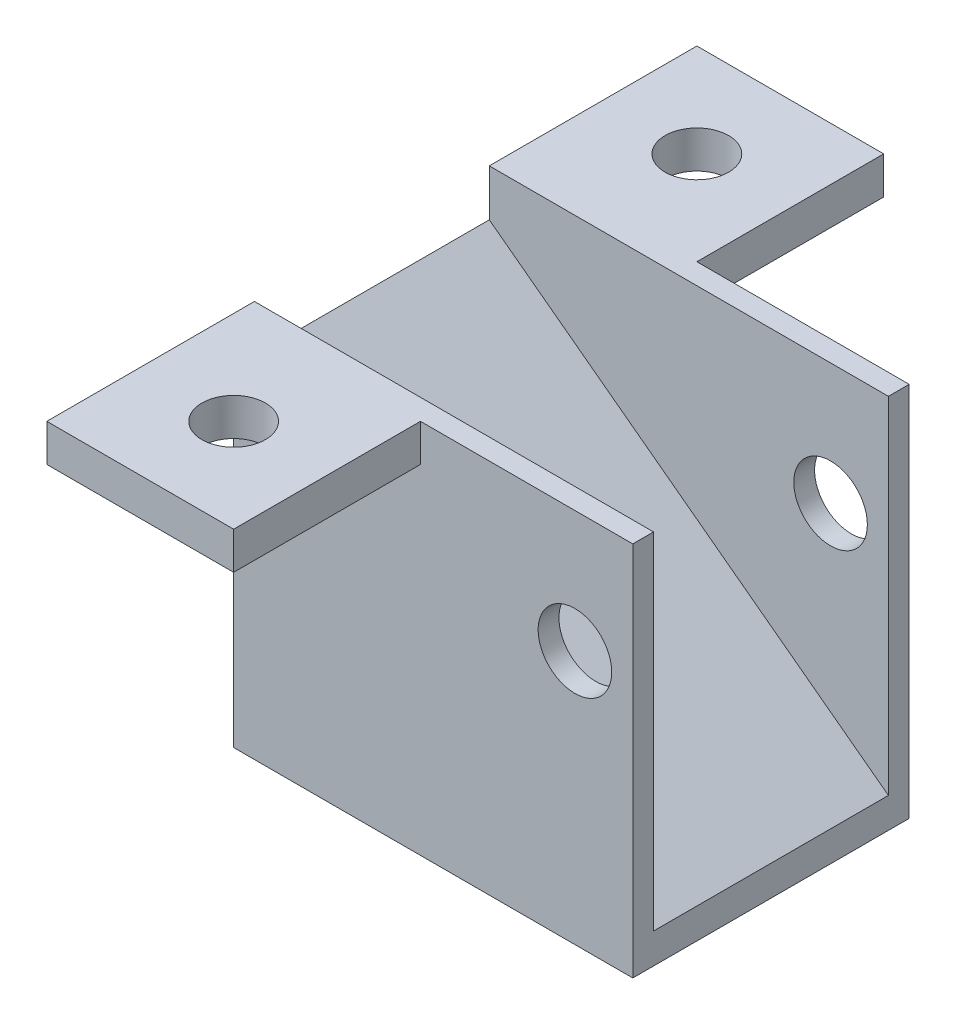
ISO-10303-21;
HEADER;
FILE_DESCRIPTION(('STEP AP214'),'2;1');
FILE_NAME('part.step','',(''),(''),'','','');
FILE_SCHEMA(('AUTOMOTIVE_DESIGN { 1 0 10303 214 1 1 1 1 }'));
ENDSEC;
DATA;
#1=APPLICATION_CONTEXT('core data for automotive mechanical design processes');
#2=APPLICATION_PROTOCOL_DEFINITION('international standard','automotive_design',2000,#1);
#3=PRODUCT_CONTEXT('',#1,'mechanical');
#4=PRODUCT('Part','Part','',(#3));
#5=PRODUCT_RELATED_PRODUCT_CATEGORY('part','',(#4));
#6=PRODUCT_DEFINITION_FORMATION('','',#4);
#7=PRODUCT_DEFINITION_CONTEXT('part definition',#1,'design');
#8=PRODUCT_DEFINITION('design','',#6,#7);
#9=PRODUCT_DEFINITION_SHAPE('','',#8);
#10=(LENGTH_UNIT() NAMED_UNIT(*) SI_UNIT(.MILLI.,.METRE.));
#11=(NAMED_UNIT(*) PLANE_ANGLE_UNIT() SI_UNIT($,.RADIAN.));
#12=(NAMED_UNIT(*) SI_UNIT($,.STERADIAN.) SOLID_ANGLE_UNIT());
#13=UNCERTAINTY_MEASURE_WITH_UNIT(LENGTH_MEASURE(1.E-05),#10,'distance_accuracy_value','');
#14=(GEOMETRIC_REPRESENTATION_CONTEXT(3) GLOBAL_UNCERTAINTY_ASSIGNED_CONTEXT((#13)) GLOBAL_UNIT_ASSIGNED_CONTEXT((#10,
#11,#12)) REPRESENTATION_CONTEXT('',''));
#15=CARTESIAN_POINT('',(0.,0.,0.));
#16=DIRECTION('',(0.,0.,1.));
#17=DIRECTION('',(1.,0.,0.));
#18=AXIS2_PLACEMENT_3D('',#15,#16,#17);
#19=CARTESIAN_POINT('',(33.8878599279876,2.05994,31.2182441441728));
#20=DIRECTION('',(0.,0.,-1.));
#21=DIRECTION('',(-1.,0.,0.));
#22=AXIS2_PLACEMENT_3D('',#19,#20,#21);
#23=PLANE('',#22);
#24=CARTESIAN_POINT('',(29.9559399279876,17.2847,31.2182441441728));
#25=DIRECTION('',(0.,0.,1.));
#26=DIRECTION('',(1.,0.,0.));
#27=AXIS2_PLACEMENT_3D('',#24,#25,#26);
#28=CIRCLE('',#27,2.50063);
#29=CARTESIAN_POINT('',(32.4565699279876,17.2847,31.2182441441728));
#30=VERTEX_POINT('',#29);
#31=EDGE_CURVE('E257',#30,#30,#28,.T.);
#32=ORIENTED_EDGE('',*,*,#31,.F.);
#33=EDGE_LOOP('',(#32));
#34=FACE_BOUND('',#33,.T.);
#35=DIRECTION('',(0.,1.,0.));
#36=VECTOR('',#35,1.);
#37=CARTESIAN_POINT('',(19.4555799279876,25.55494,31.2182441441728));
#38=LINE('',#37,#36);
#39=CARTESIAN_POINT('',(19.4555799279876,23.01494,31.2182441441728));
#40=VERTEX_POINT('',#39);
#41=CARTESIAN_POINT('',(19.4555799279876,25.55494,31.2182441441728));
#42=VERTEX_POINT('',#41);
#43=EDGE_CURVE('E199',#40,#42,#38,.T.);
#44=ORIENTED_EDGE('',*,*,#43,.F.);
#45=DIRECTION('',(1.,0.,0.));
#46=VECTOR('',#45,1.);
#47=CARTESIAN_POINT('',(6.75557992798762,23.01494,31.2182441441728));
#48=LINE('',#47,#46);
#49=CARTESIAN_POINT('',(6.75557992798762,23.01494,31.2182441441728));
#50=VERTEX_POINT('',#49);
#51=EDGE_CURVE('E57',#50,#40,#48,.T.);
#52=ORIENTED_EDGE('',*,*,#51,.F.);
#53=DIRECTION('',(0.,-1.,0.));
#54=VECTOR('',#53,1.);
#55=CARTESIAN_POINT('',(6.75557992798762,2.05994,31.2182441441728));
#56=LINE('',#55,#54);
#57=CARTESIAN_POINT('',(6.75557992798762,0.,31.2182441441728));
#58=VERTEX_POINT('',#57);
#59=EDGE_CURVE('E41',#50,#58,#56,.T.);
#60=ORIENTED_EDGE('',*,*,#59,.T.);
#61=DIRECTION('',(1.,0.,0.));
#62=VECTOR('',#61,1.);
#63=CARTESIAN_POINT('',(33.8878599279876,0.,31.2182441441728));
#64=LINE('',#63,#62);
#65=CARTESIAN_POINT('',(33.8878599279876,0.,31.2182441441728));
#66=VERTEX_POINT('',#65);
#67=EDGE_CURVE('E284',#58,#66,#64,.T.);
#68=ORIENTED_EDGE('',*,*,#67,.T.);
#69=DIRECTION('',(0.,-1.,0.));
#70=VECTOR('',#69,1.);
#71=CARTESIAN_POINT('',(33.8878599279876,2.05994,31.2182441441728));
#72=LINE('',#71,#70);
#73=CARTESIAN_POINT('',(33.8878599279876,25.55494,31.2182441441728));
#74=VERTEX_POINT('',#73);
#75=EDGE_CURVE('E299',#74,#66,#72,.T.);
#76=ORIENTED_EDGE('',*,*,#75,.F.);
#77=DIRECTION('',(1.,0.,0.));
#78=VECTOR('',#77,1.);
#79=CARTESIAN_POINT('',(6.75557992798762,25.55494,31.2182441441728));
#80=LINE('',#79,#78);
#81=EDGE_CURVE('E225',#42,#74,#80,.T.);
#82=ORIENTED_EDGE('',*,*,#81,.F.);
#83=EDGE_LOOP('',(#44,#52,#60,#68,#76,#82));
#84=FACE_BOUND('',#83,.T.);
#85=ADVANCED_FACE('F33',(#34,#84),#23,.F.);
#86=CARTESIAN_POINT('',(0.,2.05994,0.));
#87=DIRECTION('',(0.,1.,0.));
#88=DIRECTION('',(0.,0.,1.));
#89=AXIS2_PLACEMENT_3D('',#86,#87,#88);
#90=PLANE('',#89);
#91=DIRECTION('',(0.,0.,-1.));
#92=VECTOR('',#91,1.);
#93=CARTESIAN_POINT('',(6.75557992798762,2.05994,40.7468916891145));
#94=LINE('',#93,#92);
#95=CARTESIAN_POINT('',(6.75557992798762,2.05994,29.8060041441728));
#96=VERTEX_POINT('',#95);
#97=CARTESIAN_POINT('',(6.75557992798762,2.05994,13.8417792340563));
#98=VERTEX_POINT('',#97);
#99=EDGE_CURVE('E237',#96,#98,#94,.T.);
#100=ORIENTED_EDGE('',*,*,#99,.F.);
#101=DIRECTION('',(-1.,0.,0.));
#102=VECTOR('',#101,1.);
#103=CARTESIAN_POINT('',(6.75557992798762,2.05994,29.8060041441728));
#104=LINE('',#103,#102);
#105=CARTESIAN_POINT('',(30.5689196087146,2.05994,29.8060041441728));
#106=VERTEX_POINT('',#105);
#107=EDGE_CURVE('E267',#106,#96,#104,.T.);
#108=ORIENTED_EDGE('',*,*,#107,.F.);
#109=DIRECTION('',(0.,0.,-1.));
#110=VECTOR('',#109,1.);
#111=CARTESIAN_POINT('',(30.5689196087146,2.05994,29.8717192340563));
#112=LINE('',#111,#110);
#113=CARTESIAN_POINT('',(30.5689196087146,2.05994,13.8417792340563));
#114=VERTEX_POINT('',#113);
#115=EDGE_CURVE('E246',#106,#114,#112,.T.);
#116=ORIENTED_EDGE('',*,*,#115,.T.);
#117=DIRECTION('',(1.,0.,0.));
#118=VECTOR('',#117,1.);
#119=CARTESIAN_POINT('',(33.8878599279876,2.05994,13.8417792340563));
#120=LINE('',#119,#118);
#121=EDGE_CURVE('E275',#98,#114,#120,.T.);
#122=ORIENTED_EDGE('',*,*,#121,.F.);
#123=EDGE_LOOP('',(#100,#108,#116,#122));
#124=FACE_BOUND('',#123,.T.);
#125=ADVANCED_FACE('F381',(#124),#90,.T.);
#126=CARTESIAN_POINT('',(33.8878599279876,22.37994,13.8417792340563));
#127=DIRECTION('',(0.,0.,-1.));
#128=DIRECTION('',(-1.,0.,0.));
#129=AXIS2_PLACEMENT_3D('',#126,#127,#128);
#130=PLANE('',#129);
#131=DIRECTION('',(0.801501870641229,-0.59799226697225,0.));
#132=VECTOR('',#131,1.);
#133=CARTESIAN_POINT('',(6.75557992798762,19.8268267677945,13.8417792340563));
#134=LINE('',#133,#132);
#135=CARTESIAN_POINT('',(6.75557992798763,19.8268267677945,13.8417792340563));
#136=VERTEX_POINT('',#135);
#137=EDGE_CURVE('E239',#136,#114,#134,.T.);
#138=ORIENTED_EDGE('',*,*,#137,.F.);
#139=DIRECTION('',(0.,-1.,0.));
#140=VECTOR('',#139,1.);
#141=CARTESIAN_POINT('',(6.75557992798762,22.37994,13.8417792340563));
#142=LINE('',#141,#140);
#143=EDGE_CURVE('E281',#136,#98,#142,.T.);
#144=ORIENTED_EDGE('',*,*,#143,.T.);
#145=ORIENTED_EDGE('',*,*,#121,.T.);
#146=EDGE_LOOP('',(#138,#144,#145));
#147=FACE_BOUND('',#146,.T.);
#148=ADVANCED_FACE('F388',(#147),#130,.F.);
#149=CARTESIAN_POINT('',(29.9559399279876,17.2847,13.8417792340563));
#150=DIRECTION('',(0.,0.,-1.));
#151=DIRECTION('',(-1.,0.,0.));
#152=AXIS2_PLACEMENT_3D('',#149,#150,#151);
#153=CIRCLE('',#152,2.50063);
#154=CARTESIAN_POINT('',(27.4553099279876,17.2847,13.8417792340563));
#155=VERTEX_POINT('',#154);
#156=EDGE_CURVE('E261',#155,#155,#153,.T.);
#157=ORIENTED_EDGE('',*,*,#156,.T.);
#158=EDGE_LOOP('',(#157));
#159=FACE_BOUND('',#158,.T.);
#160=DIRECTION('',(-0.800413429281801,0.599448364936754,0.));
#161=VECTOR('',#160,1.);
#162=CARTESIAN_POINT('',(6.75557992798762,22.37994,13.8417792340563));
#163=LINE('',#162,#161);
#164=CARTESIAN_POINT('',(33.8878599279876,2.05994,13.8417792340563));
#165=VERTEX_POINT('',#164);
#166=CARTESIAN_POINT('',(6.75557992798762,22.37994,13.8417792340563));
#167=VERTEX_POINT('',#166);
#168=EDGE_CURVE('E242',#165,#167,#163,.T.);
#169=ORIENTED_EDGE('',*,*,#168,.F.);
#170=DIRECTION('',(0.,-1.,0.));
#171=VECTOR('',#170,1.);
#172=CARTESIAN_POINT('',(33.8878599279876,22.37994,13.8417792340563));
#173=LINE('',#172,#171);
#174=CARTESIAN_POINT('',(33.8878599279876,25.55494,13.8417792340563));
#175=VERTEX_POINT('',#174);
#176=EDGE_CURVE('E278',#175,#165,#173,.T.);
#177=ORIENTED_EDGE('',*,*,#176,.F.);
#178=DIRECTION('',(1.,0.,0.));
#179=VECTOR('',#178,1.);
#180=CARTESIAN_POINT('',(6.75557992798762,25.55494,13.8417792340563));
#181=LINE('',#180,#179);
#182=CARTESIAN_POINT('',(6.75557992798762,25.55494,13.8417792340563));
#183=VERTEX_POINT('',#182);
#184=EDGE_CURVE('E218',#183,#175,#181,.T.);
#185=ORIENTED_EDGE('',*,*,#184,.F.);
#186=DIRECTION('',(0.,-1.,0.));
#187=VECTOR('',#186,1.);
#188=CARTESIAN_POINT('',(6.75557992798762,25.55494,13.8417792340563));
#189=LINE('',#188,#187);
#190=EDGE_CURVE('E162',#183,#167,#189,.T.);
#191=ORIENTED_EDGE('',*,*,#190,.T.);
#192=EDGE_LOOP('',(#169,#177,#185,#191));
#193=FACE_BOUND('',#192,.T.);
#194=ADVANCED_FACE('F354',(#159,#193),#130,.F.);
#195=CARTESIAN_POINT('',(6.75557992798762,22.37994,29.8060041441728));
#196=DIRECTION('',(0.,0.,1.));
#197=DIRECTION('',(1.,0.,0.));
#198=AXIS2_PLACEMENT_3D('',#195,#196,#197);
#199=PLANE('',#198);
#200=DIRECTION('',(-0.801501870641229,0.59799226697225,0.));
#201=VECTOR('',#200,1.);
#202=CARTESIAN_POINT('',(5.53189338339606,20.7398066592554,29.8060041441728));
#203=LINE('',#202,#201);
#204=CARTESIAN_POINT('',(6.75557992798762,19.8268267677945,29.8060041441728));
#205=VERTEX_POINT('',#204);
#206=EDGE_CURVE('E254',#106,#205,#203,.T.);
#207=ORIENTED_EDGE('',*,*,#206,.F.);
#208=ORIENTED_EDGE('',*,*,#107,.T.);
#209=DIRECTION('',(0.,-1.,0.));
#210=VECTOR('',#209,1.);
#211=CARTESIAN_POINT('',(6.75557992798762,22.37994,29.8060041441728));
#212=LINE('',#211,#210);
#213=EDGE_CURVE('E270',#205,#96,#212,.T.);
#214=ORIENTED_EDGE('',*,*,#213,.F.);
#215=EDGE_LOOP('',(#207,#208,#214));
#216=FACE_BOUND('',#215,.T.);
#217=ADVANCED_FACE('F399',(#216),#199,.F.);
#218=CARTESIAN_POINT('',(29.9559399279876,17.2847,29.8060041441728));
#219=DIRECTION('',(0.,0.,1.));
#220=DIRECTION('',(1.,0.,0.));
#221=AXIS2_PLACEMENT_3D('',#218,#219,#220);
#222=CIRCLE('',#221,2.50063);
#223=CARTESIAN_POINT('',(32.4565699279876,17.2847,29.8060041441728));
#224=VERTEX_POINT('',#223);
#225=EDGE_CURVE('E260',#224,#224,#222,.T.);
#226=ORIENTED_EDGE('',*,*,#225,.T.);
#227=EDGE_LOOP('',(#226));
#228=FACE_BOUND('',#227,.T.);
#229=DIRECTION('',(0.800413429281801,-0.599448364936754,0.));
#230=VECTOR('',#229,1.);
#231=CARTESIAN_POINT('',(6.75557992798762,22.37994,29.8060041441728));
#232=LINE('',#231,#230);
#233=CARTESIAN_POINT('',(6.75557992798762,22.37994,29.8060041441728));
#234=VERTEX_POINT('',#233);
#235=CARTESIAN_POINT('',(33.8878599279876,2.05994,29.8060041441728));
#236=VERTEX_POINT('',#235);
#237=EDGE_CURVE('E251',#234,#236,#232,.T.);
#238=ORIENTED_EDGE('',*,*,#237,.F.);
#239=DIRECTION('',(0.,-1.,0.));
#240=VECTOR('',#239,1.);
#241=CARTESIAN_POINT('',(6.75557992798762,25.55494,29.8060041441728));
#242=LINE('',#241,#240);
#243=CARTESIAN_POINT('',(6.75557992798762,25.55494,29.8060041441728));
#244=VERTEX_POINT('',#243);
#245=EDGE_CURVE('E234',#244,#234,#242,.T.);
#246=ORIENTED_EDGE('',*,*,#245,.F.);
#247=DIRECTION('',(-1.,0.,0.));
#248=VECTOR('',#247,1.);
#249=CARTESIAN_POINT('',(33.8878599279876,25.55494,29.8060041441728));
#250=LINE('',#249,#248);
#251=CARTESIAN_POINT('',(33.8878599279876,25.55494,29.8060041441728));
#252=VERTEX_POINT('',#251);
#253=EDGE_CURVE('E230',#252,#244,#250,.T.);
#254=ORIENTED_EDGE('',*,*,#253,.F.);
#255=DIRECTION('',(0.,-1.,0.));
#256=VECTOR('',#255,1.);
#257=CARTESIAN_POINT('',(33.8878599279876,22.37994,29.8060041441728));
#258=LINE('',#257,#256);
#259=EDGE_CURVE('E273',#252,#236,#258,.T.);
#260=ORIENTED_EDGE('',*,*,#259,.T.);
#261=EDGE_LOOP('',(#238,#246,#254,#260));
#262=FACE_BOUND('',#261,.T.);
#263=ADVANCED_FACE('F350',(#228,#262),#199,.F.);
#264=CARTESIAN_POINT('',(33.8878599279876,2.05994,12.4295392340563));
#265=DIRECTION('',(-1.,0.,0.));
#266=DIRECTION('',(0.,0.,1.));
#267=AXIS2_PLACEMENT_3D('',#264,#265,#266);
#268=PLANE('',#267);
#269=DIRECTION('',(0.,0.,-1.));
#270=VECTOR('',#269,1.);
#271=CARTESIAN_POINT('',(33.8878599279876,0.,12.4295392340563));
#272=LINE('',#271,#270);
#273=CARTESIAN_POINT('',(33.8878599279876,0.,12.4295392340563));
#274=VERTEX_POINT('',#273);
#275=EDGE_CURVE('E291',#66,#274,#272,.T.);
#276=ORIENTED_EDGE('',*,*,#275,.T.);
#277=DIRECTION('',(0.,-1.,0.));
#278=VECTOR('',#277,1.);
#279=CARTESIAN_POINT('',(33.8878599279876,2.05994,12.4295392340563));
#280=LINE('',#279,#278);
#281=CARTESIAN_POINT('',(33.8878599279876,25.55494,12.4295392340563));
#282=VERTEX_POINT('',#281);
#283=EDGE_CURVE('E296',#282,#274,#280,.T.);
#284=ORIENTED_EDGE('',*,*,#283,.F.);
#285=DIRECTION('',(0.,0.,-1.));
#286=VECTOR('',#285,1.);
#287=CARTESIAN_POINT('',(33.8878599279876,25.55494,13.8417792340563));
#288=LINE('',#287,#286);
#289=EDGE_CURVE('E220',#175,#282,#288,.T.);
#290=ORIENTED_EDGE('',*,*,#289,.F.);
#291=ORIENTED_EDGE('',*,*,#176,.T.);
#292=DIRECTION('',(0.,0.,-1.));
#293=VECTOR('',#292,1.);
#294=CARTESIAN_POINT('',(33.8878599279876,2.05994,12.4295392340563));
#295=LINE('',#294,#293);
#296=EDGE_CURVE('E285',#236,#165,#295,.T.);
#297=ORIENTED_EDGE('',*,*,#296,.F.);
#298=ORIENTED_EDGE('',*,*,#259,.F.);
#299=DIRECTION('',(0.,0.,-1.));
#300=VECTOR('',#299,1.);
#301=CARTESIAN_POINT('',(33.8878599279876,25.55494,31.2182441441728));
#302=LINE('',#301,#300);
#303=EDGE_CURVE('E227',#74,#252,#302,.T.);
#304=ORIENTED_EDGE('',*,*,#303,.F.);
#305=ORIENTED_EDGE('',*,*,#75,.T.);
#306=EDGE_LOOP('',(#276,#284,#290,#291,#297,#298,#304,#305));
#307=FACE_BOUND('',#306,.T.);
#308=ADVANCED_FACE('F347',(#307),#268,.F.);
#309=CARTESIAN_POINT('',(6.75557992798762,2.05994,12.4295392340563));
#310=DIRECTION('',(0.,0.,1.));
#311=DIRECTION('',(1.,0.,0.));
#312=AXIS2_PLACEMENT_3D('',#309,#310,#311);
#313=PLANE('',#312);
#314=CARTESIAN_POINT('',(29.9559399279876,17.2847,12.4295392340563));
#315=DIRECTION('',(0.,0.,1.));
#316=DIRECTION('',(1.,0.,0.));
#317=AXIS2_PLACEMENT_3D('',#314,#315,#316);
#318=CIRCLE('',#317,2.50063);
#319=CARTESIAN_POINT('',(32.4565699279876,17.2847,12.4295392340563));
#320=VERTEX_POINT('',#319);
#321=EDGE_CURVE('E264',#320,#320,#318,.T.);
#322=ORIENTED_EDGE('',*,*,#321,.T.);
#323=EDGE_LOOP('',(#322));
#324=FACE_BOUND('',#323,.T.);
#325=DIRECTION('',(0.,-1.,0.));
#326=VECTOR('',#325,1.);
#327=CARTESIAN_POINT('',(6.75557992798762,2.05994,12.4295392340563));
#328=LINE('',#327,#326);
#329=CARTESIAN_POINT('',(6.75557992798762,23.01494,12.4295392340563));
#330=VERTEX_POINT('',#329);
#331=CARTESIAN_POINT('',(6.75557992798762,0.,12.4295392340563));
#332=VERTEX_POINT('',#331);
#333=EDGE_CURVE('E288',#330,#332,#328,.T.);
#334=ORIENTED_EDGE('',*,*,#333,.F.);
#335=DIRECTION('',(1.,0.,0.));
#336=VECTOR('',#335,1.);
#337=CARTESIAN_POINT('',(6.75557992798762,23.01494,12.4295392340563));
#338=LINE('',#337,#336);
#339=CARTESIAN_POINT('',(19.4555799279876,23.01494,12.4295392340563));
#340=VERTEX_POINT('',#339);
#341=EDGE_CURVE('E176',#330,#340,#338,.T.);
#342=ORIENTED_EDGE('',*,*,#341,.T.);
#343=DIRECTION('',(0.,1.,0.));
#344=VECTOR('',#343,1.);
#345=CARTESIAN_POINT('',(19.4555799279876,25.55494,12.4295392340563));
#346=LINE('',#345,#344);
#347=CARTESIAN_POINT('',(19.4555799279876,25.55494,12.4295392340563));
#348=VERTEX_POINT('',#347);
#349=EDGE_CURVE('E187',#340,#348,#346,.T.);
#350=ORIENTED_EDGE('',*,*,#349,.T.);
#351=DIRECTION('',(-1.,0.,0.));
#352=VECTOR('',#351,1.);
#353=CARTESIAN_POINT('',(33.8878599279876,25.55494,12.4295392340563));
#354=LINE('',#353,#352);
#355=EDGE_CURVE('E167',#282,#348,#354,.T.);
#356=ORIENTED_EDGE('',*,*,#355,.F.);
#357=ORIENTED_EDGE('',*,*,#283,.T.);
#358=DIRECTION('',(-1.,0.,0.));
#359=VECTOR('',#358,1.);
#360=CARTESIAN_POINT('',(6.75557992798762,0.,12.4295392340563));
#361=LINE('',#360,#359);
#362=EDGE_CURVE('E289',#274,#332,#361,.T.);
#363=ORIENTED_EDGE('',*,*,#362,.T.);
#364=EDGE_LOOP('',(#334,#342,#350,#356,#357,#363));
#365=FACE_BOUND('',#364,.T.);
#366=ADVANCED_FACE('F359',(#324,#365),#313,.F.);
#367=CARTESIAN_POINT('',(0.,0.,0.));
#368=DIRECTION('',(0.,1.,0.));
#369=DIRECTION('',(0.,0.,1.));
#370=AXIS2_PLACEMENT_3D('',#367,#368,#369);
#371=PLANE('',#370);
#372=ORIENTED_EDGE('',*,*,#67,.F.);
#373=DIRECTION('',(0.,0.,-1.));
#374=VECTOR('',#373,1.);
#375=CARTESIAN_POINT('',(6.75557992798762,0.,0.));
#376=LINE('',#375,#374);
#377=EDGE_CURVE('E11',#58,#332,#376,.T.);
#378=ORIENTED_EDGE('',*,*,#377,.T.);
#379=ORIENTED_EDGE('',*,*,#362,.F.);
#380=ORIENTED_EDGE('',*,*,#275,.F.);
#381=EDGE_LOOP('',(#372,#378,#379,#380));
#382=FACE_BOUND('',#381,.T.);
#383=ADVANCED_FACE('F366',(#382),#371,.F.);
#384=CARTESIAN_POINT('',(6.75557992798762,22.37994,13.8417792340563));
#385=DIRECTION('',(1.,0.,0.));
#386=DIRECTION('',(0.,0.,-1.));
#387=AXIS2_PLACEMENT_3D('',#384,#385,#386);
#388=PLANE('',#387);
#389=ORIENTED_EDGE('',*,*,#59,.F.);
#390=DIRECTION('',(0.,0.,-1.));
#391=VECTOR('',#390,1.);
#392=CARTESIAN_POINT('',(6.75557992798762,23.01494,43.9182441441728));
#393=LINE('',#392,#391);
#394=CARTESIAN_POINT('',(6.75557992798762,23.01494,43.9182441441728));
#395=VERTEX_POINT('',#394);
#396=EDGE_CURVE('E215',#395,#50,#393,.T.);
#397=ORIENTED_EDGE('',*,*,#396,.F.);
#398=DIRECTION('',(0.,-1.,0.));
#399=VECTOR('',#398,1.);
#400=CARTESIAN_POINT('',(6.75557992798762,25.55494,43.9182441441728));
#401=LINE('',#400,#399);
#402=CARTESIAN_POINT('',(6.75557992798762,25.55494,43.9182441441728));
#403=VERTEX_POINT('',#402);
#404=EDGE_CURVE('E195',#403,#395,#401,.T.);
#405=ORIENTED_EDGE('',*,*,#404,.F.);
#406=DIRECTION('',(0.,0.,1.));
#407=VECTOR('',#406,1.);
#408=CARTESIAN_POINT('',(6.75557992798762,25.55494,29.8060041441728));
#409=LINE('',#408,#407);
#410=EDGE_CURVE('E232',#244,#403,#409,.T.);
#411=ORIENTED_EDGE('',*,*,#410,.F.);
#412=ORIENTED_EDGE('',*,*,#245,.T.);
#413=DIRECTION('',(0.,0.,-1.));
#414=VECTOR('',#413,1.);
#415=CARTESIAN_POINT('',(6.75557992798762,22.37994,29.8717192340563));
#416=LINE('',#415,#414);
#417=EDGE_CURVE('E244',#234,#167,#416,.T.);
#418=ORIENTED_EDGE('',*,*,#417,.T.);
#419=ORIENTED_EDGE('',*,*,#190,.F.);
#420=DIRECTION('',(0.,0.,1.));
#421=VECTOR('',#420,1.);
#422=CARTESIAN_POINT('',(6.75557992798762,25.55494,12.4295392340563));
#423=LINE('',#422,#421);
#424=CARTESIAN_POINT('',(6.75557992798762,25.55494,-0.270460765943725));
#425=VERTEX_POINT('',#424);
#426=EDGE_CURVE('E154',#425,#183,#423,.T.);
#427=ORIENTED_EDGE('',*,*,#426,.F.);
#428=DIRECTION('',(0.,-1.,0.));
#429=VECTOR('',#428,1.);
#430=CARTESIAN_POINT('',(6.75557992798762,25.55494,-0.270460765943725));
#431=LINE('',#430,#429);
#432=CARTESIAN_POINT('',(6.75557992798762,23.01494,-0.270460765943725));
#433=VERTEX_POINT('',#432);
#434=EDGE_CURVE('E158',#425,#433,#431,.T.);
#435=ORIENTED_EDGE('',*,*,#434,.T.);
#436=DIRECTION('',(0.,0.,1.));
#437=VECTOR('',#436,1.);
#438=CARTESIAN_POINT('',(6.75557992798762,23.01494,-0.270460765943725));
#439=LINE('',#438,#437);
#440=EDGE_CURVE('E186',#433,#330,#439,.T.);
#441=ORIENTED_EDGE('',*,*,#440,.T.);
#442=ORIENTED_EDGE('',*,*,#333,.T.);
#443=ORIENTED_EDGE('',*,*,#377,.F.);
#444=EDGE_LOOP('',(#389,#397,#405,#411,#412,#418,#419,#427,#435,#441,#442,#443));
#445=FACE_BOUND('',#444,.T.);
#446=ORIENTED_EDGE('',*,*,#213,.T.);
#447=ORIENTED_EDGE('',*,*,#99,.T.);
#448=ORIENTED_EDGE('',*,*,#143,.F.);
#449=DIRECTION('',(0.,0.,-1.));
#450=VECTOR('',#449,1.);
#451=CARTESIAN_POINT('',(6.75557992798762,19.8268267677945,29.8717192340563));
#452=LINE('',#451,#450);
#453=EDGE_CURVE('E248',#205,#136,#452,.T.);
#454=ORIENTED_EDGE('',*,*,#453,.F.);
#455=EDGE_LOOP('',(#446,#447,#448,#454));
#456=FACE_BOUND('',#455,.T.);
#457=ADVANCED_FACE('F156',(#445,#456),#388,.F.);
#458=CARTESIAN_POINT('',(29.9559399279876,17.2847,5.8182441441728));
#459=DIRECTION('',(0.,0.,1.));
#460=DIRECTION('',(1.,0.,0.));
#461=AXIS2_PLACEMENT_3D('',#458,#459,#460);
#462=CYLINDRICAL_SURFACE('',#461,2.50063);
#463=ORIENTED_EDGE('',*,*,#31,.T.);
#464=EDGE_LOOP('',(#463));
#465=FACE_BOUND('',#464,.T.);
#466=ORIENTED_EDGE('',*,*,#225,.F.);
#467=EDGE_LOOP('',(#466));
#468=FACE_BOUND('',#467,.T.);
#469=ADVANCED_FACE('F374',(#465,#468),#462,.F.);
#470=ORIENTED_EDGE('',*,*,#156,.F.);
#471=EDGE_LOOP('',(#470));
#472=FACE_BOUND('',#471,.T.);
#473=ORIENTED_EDGE('',*,*,#321,.F.);
#474=EDGE_LOOP('',(#473));
#475=FACE_BOUND('',#474,.T.);
#476=ADVANCED_FACE('F394',(#472,#475),#462,.F.);
#477=CARTESIAN_POINT('',(6.75557992798762,19.8268267677945,29.8717192340563));
#478=DIRECTION('',(0.59799226697225,0.801501870641229,0.));
#479=DIRECTION('',(-0.801501870641229,0.59799226697225,0.));
#480=AXIS2_PLACEMENT_3D('',#477,#478,#479);
#481=PLANE('',#480);
#482=ORIENTED_EDGE('',*,*,#115,.F.);
#483=ORIENTED_EDGE('',*,*,#206,.T.);
#484=ORIENTED_EDGE('',*,*,#453,.T.);
#485=ORIENTED_EDGE('',*,*,#137,.T.);
#486=EDGE_LOOP('',(#482,#483,#484,#485));
#487=FACE_BOUND('',#486,.T.);
#488=ADVANCED_FACE('F417',(#487),#481,.F.);
#489=CARTESIAN_POINT('',(6.75557992798762,22.37994,29.8717192340563));
#490=DIRECTION('',(-0.599448364936754,-0.800413429281801,0.));
#491=DIRECTION('',(0.800413429281801,-0.599448364936754,0.));
#492=AXIS2_PLACEMENT_3D('',#489,#490,#491);
#493=PLANE('',#492);
#494=ORIENTED_EDGE('',*,*,#417,.F.);
#495=ORIENTED_EDGE('',*,*,#237,.T.);
#496=ORIENTED_EDGE('',*,*,#296,.T.);
#497=ORIENTED_EDGE('',*,*,#168,.T.);
#498=EDGE_LOOP('',(#494,#495,#496,#497));
#499=FACE_BOUND('',#498,.T.);
#500=ADVANCED_FACE('F324',(#499),#493,.F.);
#501=CARTESIAN_POINT('',(0.,25.55494,0.));
#502=DIRECTION('',(0.,1.,0.));
#503=DIRECTION('',(0.,0.,1.));
#504=AXIS2_PLACEMENT_3D('',#501,#502,#503);
#505=PLANE('',#504);
#506=CARTESIAN_POINT('',(13.1055799279876,25.55494,37.5682441441728));
#507=DIRECTION('',(0.,1.,0.));
#508=DIRECTION('',(0.,0.,-1.));
#509=AXIS2_PLACEMENT_3D('',#506,#507,#508);
#510=CIRCLE('',#509,2.159);
#511=CARTESIAN_POINT('',(13.1055799279876,25.55494,35.4092441441728));
#512=VERTEX_POINT('',#511);
#513=EDGE_CURVE('E311',#512,#512,#510,.T.);
#514=ORIENTED_EDGE('',*,*,#513,.F.);
#515=EDGE_LOOP('',(#514));
#516=FACE_BOUND('',#515,.T.);
#517=ORIENTED_EDGE('',*,*,#410,.T.);
#518=DIRECTION('',(-1.,0.,0.));
#519=VECTOR('',#518,1.);
#520=CARTESIAN_POINT('',(6.75557992798762,25.55494,43.9182441441728));
#521=LINE('',#520,#519);
#522=CARTESIAN_POINT('',(19.4555799279876,25.55494,43.9182441441728));
#523=VERTEX_POINT('',#522);
#524=EDGE_CURVE('E203',#523,#403,#521,.T.);
#525=ORIENTED_EDGE('',*,*,#524,.F.);
#526=DIRECTION('',(0.,0.,-1.));
#527=VECTOR('',#526,1.);
#528=CARTESIAN_POINT('',(19.4555799279876,25.55494,43.9182441441728));
#529=LINE('',#528,#527);
#530=EDGE_CURVE('E206',#523,#42,#529,.T.);
#531=ORIENTED_EDGE('',*,*,#530,.T.);
#532=ORIENTED_EDGE('',*,*,#81,.T.);
#533=ORIENTED_EDGE('',*,*,#303,.T.);
#534=ORIENTED_EDGE('',*,*,#253,.T.);
#535=EDGE_LOOP('',(#517,#525,#531,#532,#533,#534));
#536=FACE_BOUND('',#535,.T.);
#537=ADVANCED_FACE('F321',(#516,#536),#505,.T.);
#538=CARTESIAN_POINT('',(0.,25.55494,0.));
#539=DIRECTION('',(0.,1.,0.));
#540=DIRECTION('',(0.,0.,1.));
#541=AXIS2_PLACEMENT_3D('',#538,#539,#540);
#542=PLANE('',#541);
#543=CARTESIAN_POINT('',(13.1055799279876,25.55494,6.07953923405627));
#544=DIRECTION('',(0.,1.,0.));
#545=DIRECTION('',(0.,0.,1.));
#546=AXIS2_PLACEMENT_3D('',#543,#544,#545);
#547=CIRCLE('',#546,2.159);
#548=CARTESIAN_POINT('',(13.1055799279876,25.55494,8.23853923405627));
#549=VERTEX_POINT('',#548);
#550=EDGE_CURVE('E306',#549,#549,#547,.T.);
#551=ORIENTED_EDGE('',*,*,#550,.F.);
#552=EDGE_LOOP('',(#551));
#553=FACE_BOUND('',#552,.T.);
#554=ORIENTED_EDGE('',*,*,#184,.T.);
#555=ORIENTED_EDGE('',*,*,#289,.T.);
#556=ORIENTED_EDGE('',*,*,#355,.T.);
#557=DIRECTION('',(0.,0.,1.));
#558=VECTOR('',#557,1.);
#559=CARTESIAN_POINT('',(19.4555799279876,25.55494,-0.270460765943725));
#560=LINE('',#559,#558);
#561=CARTESIAN_POINT('',(19.4555799279876,25.55494,-0.270460765943725));
#562=VERTEX_POINT('',#561);
#563=EDGE_CURVE('E49',#562,#348,#560,.T.);
#564=ORIENTED_EDGE('',*,*,#563,.F.);
#565=DIRECTION('',(-1.,0.,0.));
#566=VECTOR('',#565,1.);
#567=CARTESIAN_POINT('',(6.75557992798762,25.55494,-0.270460765943725));
#568=LINE('',#567,#566);
#569=EDGE_CURVE('E173',#562,#425,#568,.T.);
#570=ORIENTED_EDGE('',*,*,#569,.T.);
#571=ORIENTED_EDGE('',*,*,#426,.T.);
#572=EDGE_LOOP('',(#554,#555,#556,#564,#570,#571));
#573=FACE_BOUND('',#572,.T.);
#574=ADVANCED_FACE('F178',(#553,#573),#542,.T.);
#575=CARTESIAN_POINT('',(6.75557992798762,23.01494,43.9182441441728));
#576=DIRECTION('',(0.,1.,0.));
#577=DIRECTION('',(0.,0.,1.));
#578=AXIS2_PLACEMENT_3D('',#575,#576,#577);
#579=PLANE('',#578);
#580=CARTESIAN_POINT('',(13.1055799279876,23.01494,37.5682441441728));
#581=DIRECTION('',(0.,1.,0.));
#582=DIRECTION('',(0.,0.,1.));
#583=AXIS2_PLACEMENT_3D('',#580,#581,#582);
#584=CIRCLE('',#583,2.159);
#585=CARTESIAN_POINT('',(13.1055799279876,23.01494,39.7272441441728));
#586=VERTEX_POINT('',#585);
#587=EDGE_CURVE('E36',#586,#586,#584,.T.);
#588=ORIENTED_EDGE('',*,*,#587,.T.);
#589=EDGE_LOOP('',(#588));
#590=FACE_BOUND('',#589,.T.);
#591=ORIENTED_EDGE('',*,*,#51,.T.);
#592=DIRECTION('',(0.,0.,-1.));
#593=VECTOR('',#592,1.);
#594=CARTESIAN_POINT('',(19.4555799279876,23.01494,43.9182441441728));
#595=LINE('',#594,#593);
#596=CARTESIAN_POINT('',(19.4555799279876,23.01494,43.9182441441728));
#597=VERTEX_POINT('',#596);
#598=EDGE_CURVE('E212',#597,#40,#595,.T.);
#599=ORIENTED_EDGE('',*,*,#598,.F.);
#600=DIRECTION('',(1.,0.,0.));
#601=VECTOR('',#600,1.);
#602=CARTESIAN_POINT('',(6.75557992798762,23.01494,43.9182441441728));
#603=LINE('',#602,#601);
#604=EDGE_CURVE('E198',#395,#597,#603,.T.);
#605=ORIENTED_EDGE('',*,*,#604,.F.);
#606=ORIENTED_EDGE('',*,*,#396,.T.);
#607=EDGE_LOOP('',(#591,#599,#605,#606));
#608=FACE_BOUND('',#607,.T.);
#609=ADVANCED_FACE('F338',(#590,#608),#579,.F.);
#610=CARTESIAN_POINT('',(19.4555799279876,25.55494,43.9182441441728));
#611=DIRECTION('',(-1.,0.,0.));
#612=DIRECTION('',(0.,0.,1.));
#613=AXIS2_PLACEMENT_3D('',#610,#611,#612);
#614=PLANE('',#613);
#615=ORIENTED_EDGE('',*,*,#43,.T.);
#616=ORIENTED_EDGE('',*,*,#530,.F.);
#617=DIRECTION('',(0.,1.,0.));
#618=VECTOR('',#617,1.);
#619=CARTESIAN_POINT('',(19.4555799279876,25.55494,43.9182441441728));
#620=LINE('',#619,#618);
#621=EDGE_CURVE('E201',#597,#523,#620,.T.);
#622=ORIENTED_EDGE('',*,*,#621,.F.);
#623=ORIENTED_EDGE('',*,*,#598,.T.);
#624=EDGE_LOOP('',(#615,#616,#622,#623));
#625=FACE_BOUND('',#624,.T.);
#626=ADVANCED_FACE('F341',(#625),#614,.F.);
#627=CARTESIAN_POINT('',(0.,0.,43.9182441441728));
#628=DIRECTION('',(0.,0.,1.));
#629=DIRECTION('',(1.,0.,0.));
#630=AXIS2_PLACEMENT_3D('',#627,#628,#629);
#631=PLANE('',#630);
#632=ORIENTED_EDGE('',*,*,#404,.T.);
#633=ORIENTED_EDGE('',*,*,#604,.T.);
#634=ORIENTED_EDGE('',*,*,#621,.T.);
#635=ORIENTED_EDGE('',*,*,#524,.T.);
#636=EDGE_LOOP('',(#632,#633,#634,#635));
#637=FACE_BOUND('',#636,.T.);
#638=ADVANCED_FACE('F332',(#637),#631,.T.);
#639=CARTESIAN_POINT('',(19.4555799279876,25.55494,-0.270460765943725));
#640=DIRECTION('',(1.,0.,0.));
#641=DIRECTION('',(0.,0.,-1.));
#642=AXIS2_PLACEMENT_3D('',#639,#640,#641);
#643=PLANE('',#642);
#644=ORIENTED_EDGE('',*,*,#349,.F.);
#645=DIRECTION('',(0.,0.,1.));
#646=VECTOR('',#645,1.);
#647=CARTESIAN_POINT('',(19.4555799279876,23.01494,-0.270460765943725));
#648=LINE('',#647,#646);
#649=CARTESIAN_POINT('',(19.4555799279876,23.01494,-0.270460765943725));
#650=VERTEX_POINT('',#649);
#651=EDGE_CURVE('E192',#650,#340,#648,.T.);
#652=ORIENTED_EDGE('',*,*,#651,.F.);
#653=DIRECTION('',(0.,1.,0.));
#654=VECTOR('',#653,1.);
#655=CARTESIAN_POINT('',(19.4555799279876,25.55494,-0.270460765943725));
#656=LINE('',#655,#654);
#657=EDGE_CURVE('E180',#650,#562,#656,.T.);
#658=ORIENTED_EDGE('',*,*,#657,.T.);
#659=ORIENTED_EDGE('',*,*,#563,.T.);
#660=EDGE_LOOP('',(#644,#652,#658,#659));
#661=FACE_BOUND('',#660,.T.);
#662=ADVANCED_FACE('F362',(#661),#643,.T.);
#663=CARTESIAN_POINT('',(6.75557992798762,23.01494,-0.270460765943725));
#664=DIRECTION('',(0.,-1.,0.));
#665=DIRECTION('',(0.,0.,-1.));
#666=AXIS2_PLACEMENT_3D('',#663,#664,#665);
#667=PLANE('',#666);
#668=CARTESIAN_POINT('',(13.1055799279876,23.01494,6.07953923405627));
#669=DIRECTION('',(0.,-1.,0.));
#670=DIRECTION('',(0.,0.,-1.));
#671=AXIS2_PLACEMENT_3D('',#668,#669,#670);
#672=CIRCLE('',#671,2.159);
#673=CARTESIAN_POINT('',(13.1055799279876,23.01494,3.92053923405628));
#674=VERTEX_POINT('',#673);
#675=EDGE_CURVE('E304',#674,#674,#672,.T.);
#676=ORIENTED_EDGE('',*,*,#675,.F.);
#677=EDGE_LOOP('',(#676));
#678=FACE_BOUND('',#677,.T.);
#679=ORIENTED_EDGE('',*,*,#341,.F.);
#680=ORIENTED_EDGE('',*,*,#440,.F.);
#681=DIRECTION('',(1.,0.,0.));
#682=VECTOR('',#681,1.);
#683=CARTESIAN_POINT('',(6.75557992798762,23.01494,-0.270460765943725));
#684=LINE('',#683,#682);
#685=EDGE_CURVE('E175',#433,#650,#684,.T.);
#686=ORIENTED_EDGE('',*,*,#685,.T.);
#687=ORIENTED_EDGE('',*,*,#651,.T.);
#688=EDGE_LOOP('',(#679,#680,#686,#687));
#689=FACE_BOUND('',#688,.T.);
#690=ADVANCED_FACE('F364',(#678,#689),#667,.T.);
#691=CARTESIAN_POINT('',(0.,0.,-0.270460765943725));
#692=DIRECTION('',(0.,0.,-1.));
#693=DIRECTION('',(1.,0.,0.));
#694=AXIS2_PLACEMENT_3D('',#691,#692,#693);
#695=PLANE('',#694);
#696=ORIENTED_EDGE('',*,*,#434,.F.);
#697=ORIENTED_EDGE('',*,*,#569,.F.);
#698=ORIENTED_EDGE('',*,*,#657,.F.);
#699=ORIENTED_EDGE('',*,*,#685,.F.);
#700=EDGE_LOOP('',(#696,#697,#698,#699));
#701=FACE_BOUND('',#700,.T.);
#702=ADVANCED_FACE('F171',(#701),#695,.T.);
#703=CARTESIAN_POINT('',(13.1055799279876,0.,6.07953923405627));
#704=DIRECTION('',(0.,1.,0.));
#705=DIRECTION('',(0.,0.,1.));
#706=AXIS2_PLACEMENT_3D('',#703,#704,#705);
#707=CYLINDRICAL_SURFACE('',#706,2.159);
#708=ORIENTED_EDGE('',*,*,#675,.T.);
#709=EDGE_LOOP('',(#708));
#710=FACE_BOUND('',#709,.T.);
#711=ORIENTED_EDGE('',*,*,#550,.T.);
#712=EDGE_LOOP('',(#711));
#713=FACE_BOUND('',#712,.T.);
#714=ADVANCED_FACE('F444',(#710,#713),#707,.F.);
#715=CARTESIAN_POINT('',(13.1055799279876,0.,37.5682441441728));
#716=DIRECTION('',(0.,1.,0.));
#717=DIRECTION('',(0.,0.,1.));
#718=AXIS2_PLACEMENT_3D('',#715,#716,#717);
#719=CYLINDRICAL_SURFACE('',#718,2.159);
#720=ORIENTED_EDGE('',*,*,#513,.T.);
#721=EDGE_LOOP('',(#720));
#722=FACE_BOUND('',#721,.T.);
#723=ORIENTED_EDGE('',*,*,#587,.F.);
#724=EDGE_LOOP('',(#723));
#725=FACE_BOUND('',#724,.T.);
#726=ADVANCED_FACE('F318',(#722,#725),#719,.F.);
#727=CLOSED_SHELL('',(#85,#125,#148,#194,#217,#263,#308,#366,#383,#457,#469,#476,#488,#500,#537,
#574,#609,#626,#638,#662,#690,#702,#714,#726));
#728=MANIFOLD_SOLID_BREP('B2',#727);
#729=ADVANCED_BREP_SHAPE_REPRESENTATION('',(#18,#728),#14);
#730=SHAPE_DEFINITION_REPRESENTATION(#9,#729);
ENDSEC;
END-ISO-10303-21;
